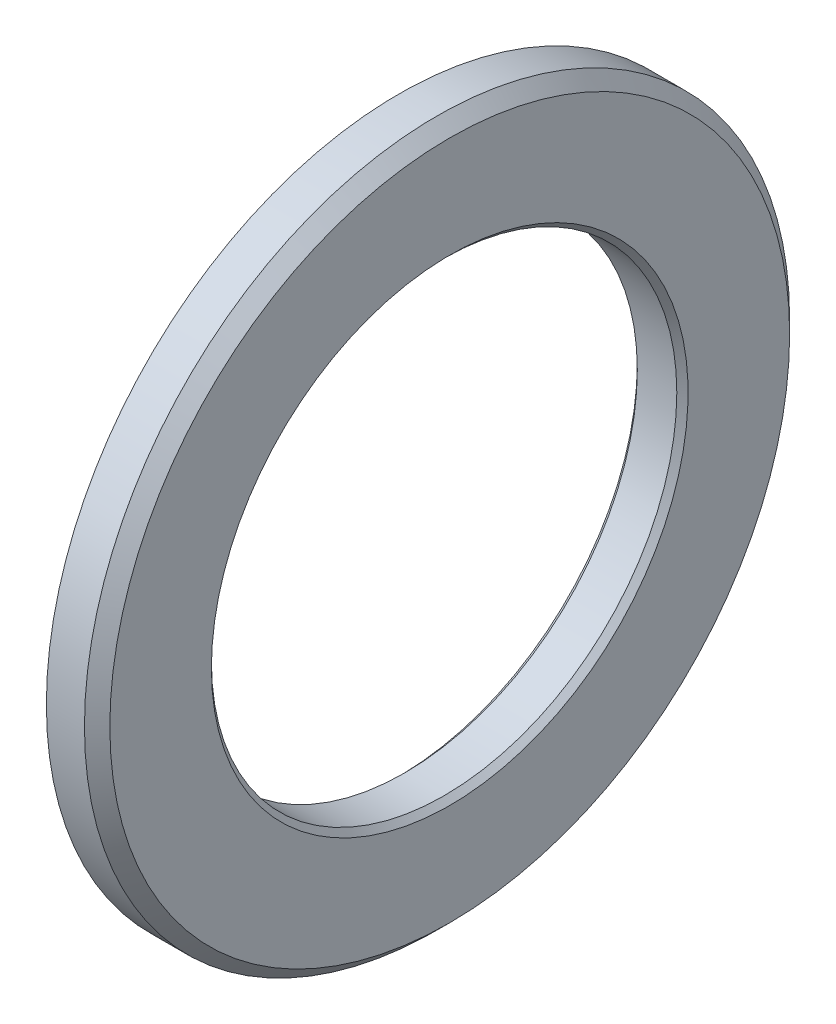
ISO-10303-21;
HEADER;
FILE_DESCRIPTION(('STEP AP214'),'2;1');
FILE_NAME('part.step','',(''),(''),'','','');
FILE_SCHEMA(('AUTOMOTIVE_DESIGN { 1 0 10303 214 1 1 1 1 }'));
ENDSEC;
DATA;
#1=APPLICATION_CONTEXT('core data for automotive mechanical design processes');
#2=APPLICATION_PROTOCOL_DEFINITION('international standard','automotive_design',2000,#1);
#3=PRODUCT_CONTEXT('',#1,'mechanical');
#4=PRODUCT('Part','Part','',(#3));
#5=PRODUCT_RELATED_PRODUCT_CATEGORY('part','',(#4));
#6=PRODUCT_DEFINITION_FORMATION('','',#4);
#7=PRODUCT_DEFINITION_CONTEXT('part definition',#1,'design');
#8=PRODUCT_DEFINITION('design','',#6,#7);
#9=PRODUCT_DEFINITION_SHAPE('','',#8);
#10=(LENGTH_UNIT() NAMED_UNIT(*) SI_UNIT(.MILLI.,.METRE.));
#11=(NAMED_UNIT(*) PLANE_ANGLE_UNIT() SI_UNIT($,.RADIAN.));
#12=(NAMED_UNIT(*) SI_UNIT($,.STERADIAN.) SOLID_ANGLE_UNIT());
#13=UNCERTAINTY_MEASURE_WITH_UNIT(LENGTH_MEASURE(1.E-05),#10,'distance_accuracy_value','');
#14=(GEOMETRIC_REPRESENTATION_CONTEXT(3) GLOBAL_UNCERTAINTY_ASSIGNED_CONTEXT((#13)) GLOBAL_UNIT_ASSIGNED_CONTEXT((#10,
#11,#12)) REPRESENTATION_CONTEXT('',''));
#15=CARTESIAN_POINT('',(0.,0.,0.));
#16=DIRECTION('',(0.,0.,1.));
#17=DIRECTION('',(1.,0.,0.));
#18=AXIS2_PLACEMENT_3D('',#15,#16,#17);
#19=CARTESIAN_POINT('',(-34.9249999999999,0.,0.));
#20=DIRECTION('',(-1.,0.,0.));
#21=DIRECTION('',(0.,0.,1.));
#22=AXIS2_PLACEMENT_3D('',#19,#20,#21);
#23=CYLINDRICAL_SURFACE('',#22,82.5);
#24=CARTESIAN_POINT('',(-16.,0.,0.));
#25=DIRECTION('',(1.,0.,0.));
#26=DIRECTION('',(0.,0.,-1.));
#27=AXIS2_PLACEMENT_3D('',#24,#25,#26);
#28=CIRCLE('',#27,82.5);
#29=CARTESIAN_POINT('',(-16.,0.,-82.5));
#30=VERTEX_POINT('',#29);
#31=EDGE_CURVE('E37',#30,#30,#28,.F.);
#32=ORIENTED_EDGE('',*,*,#31,.T.);
#33=EDGE_LOOP('',(#32));
#34=FACE_BOUND('',#33,.T.);
#35=CARTESIAN_POINT('',(-2.00000000000003,0.,0.));
#36=DIRECTION('',(-1.,0.,0.));
#37=DIRECTION('',(0.,0.,1.));
#38=AXIS2_PLACEMENT_3D('',#35,#36,#37);
#39=CIRCLE('',#38,82.5);
#40=CARTESIAN_POINT('',(-2.00000000000003,0.,82.5));
#41=VERTEX_POINT('',#40);
#42=EDGE_CURVE('E50',#41,#41,#39,.F.);
#43=ORIENTED_EDGE('',*,*,#42,.T.);
#44=EDGE_LOOP('',(#43));
#45=FACE_BOUND('',#44,.T.);
#46=ADVANCED_FACE('F30',(#34,#45),#23,.F.);
#47=CARTESIAN_POINT('',(0.,82.5,0.));
#48=DIRECTION('',(-1.,0.,0.));
#49=DIRECTION('',(0.,0.,1.));
#50=AXIS2_PLACEMENT_3D('',#47,#48,#49);
#51=PLANE('',#50);
#52=CARTESIAN_POINT('',(0.,0.,0.));
#53=DIRECTION('',(-1.,0.,0.));
#54=DIRECTION('',(0.,0.,1.));
#55=AXIS2_PLACEMENT_3D('',#52,#53,#54);
#56=CIRCLE('',#55,120.5);
#57=CARTESIAN_POINT('',(0.,0.,120.5));
#58=VERTEX_POINT('',#57);
#59=EDGE_CURVE('E41',#58,#58,#56,.F.);
#60=ORIENTED_EDGE('',*,*,#59,.T.);
#61=EDGE_LOOP('',(#60));
#62=FACE_BOUND('',#61,.T.);
#63=CARTESIAN_POINT('',(0.,0.,0.));
#64=DIRECTION('',(-1.,0.,0.));
#65=DIRECTION('',(0.,0.,1.));
#66=AXIS2_PLACEMENT_3D('',#63,#64,#65);
#67=CIRCLE('',#66,84.5);
#68=CARTESIAN_POINT('',(0.,0.,84.5));
#69=VERTEX_POINT('',#68);
#70=EDGE_CURVE('E53',#69,#69,#67,.T.);
#71=ORIENTED_EDGE('',*,*,#70,.T.);
#72=EDGE_LOOP('',(#71));
#73=FACE_BOUND('',#72,.T.);
#74=ADVANCED_FACE('F64',(#62,#73),#51,.F.);
#75=CARTESIAN_POINT('',(-34.9249999999999,0.,0.));
#76=DIRECTION('',(-1.,0.,0.));
#77=DIRECTION('',(0.,0.,1.));
#78=AXIS2_PLACEMENT_3D('',#75,#76,#77);
#79=CYLINDRICAL_SURFACE('',#78,125.);
#80=CARTESIAN_POINT('',(-4.49999999999999,0.,0.));
#81=DIRECTION('',(-1.,0.,0.));
#82=DIRECTION('',(0.,0.,1.));
#83=AXIS2_PLACEMENT_3D('',#80,#81,#82);
#84=CIRCLE('',#83,125.);
#85=CARTESIAN_POINT('',(-4.49999999999999,0.,125.));
#86=VERTEX_POINT('',#85);
#87=EDGE_CURVE('E45',#86,#86,#84,.T.);
#88=ORIENTED_EDGE('',*,*,#87,.T.);
#89=EDGE_LOOP('',(#88));
#90=FACE_BOUND('',#89,.T.);
#91=CARTESIAN_POINT('',(-18.,0.,0.));
#92=DIRECTION('',(-1.,0.,0.));
#93=DIRECTION('',(0.,0.,1.));
#94=AXIS2_PLACEMENT_3D('',#91,#92,#93);
#95=CIRCLE('',#94,125.);
#96=CARTESIAN_POINT('',(-18.,0.,125.));
#97=VERTEX_POINT('',#96);
#98=EDGE_CURVE('E56',#97,#97,#95,.T.);
#99=ORIENTED_EDGE('',*,*,#98,.F.);
#100=EDGE_LOOP('',(#99));
#101=FACE_BOUND('',#100,.T.);
#102=ADVANCED_FACE('F62',(#90,#101),#79,.T.);
#103=CARTESIAN_POINT('',(-18.,125.,0.));
#104=DIRECTION('',(1.,0.,0.));
#105=DIRECTION('',(0.,0.,-1.));
#106=AXIS2_PLACEMENT_3D('',#103,#104,#105);
#107=PLANE('',#106);
#108=CARTESIAN_POINT('',(-18.,0.,0.));
#109=DIRECTION('',(1.,0.,0.));
#110=DIRECTION('',(0.,0.,-1.));
#111=AXIS2_PLACEMENT_3D('',#108,#109,#110);
#112=CIRCLE('',#111,84.5);
#113=CARTESIAN_POINT('',(-18.,0.,-84.5));
#114=VERTEX_POINT('',#113);
#115=EDGE_CURVE('E10',#114,#114,#112,.T.);
#116=ORIENTED_EDGE('',*,*,#115,.T.);
#117=EDGE_LOOP('',(#116));
#118=FACE_BOUND('',#117,.T.);
#119=ORIENTED_EDGE('',*,*,#98,.T.);
#120=EDGE_LOOP('',(#119));
#121=FACE_BOUND('',#120,.T.);
#122=ADVANCED_FACE('F60',(#118,#121),#107,.F.);
#123=CARTESIAN_POINT('',(0.,0.,0.));
#124=DIRECTION('',(1.,0.,0.));
#125=DIRECTION('',(0.,0.,-1.));
#126=AXIS2_PLACEMENT_3D('',#123,#124,#125);
#127=CONICAL_SURFACE('',#126,84.5,0.785398163397438);
#128=ORIENTED_EDGE('',*,*,#42,.F.);
#129=EDGE_LOOP('',(#128));
#130=FACE_BOUND('',#129,.T.);
#131=ORIENTED_EDGE('',*,*,#70,.F.);
#132=EDGE_LOOP('',(#131));
#133=FACE_BOUND('',#132,.T.);
#134=ADVANCED_FACE('F71',(#130,#133),#127,.F.);
#135=CARTESIAN_POINT('',(-4.49999999999999,0.,0.));
#136=DIRECTION('',(-1.,0.,0.));
#137=DIRECTION('',(0.,0.,1.));
#138=AXIS2_PLACEMENT_3D('',#135,#136,#137);
#139=CONICAL_SURFACE('',#138,125.,0.78539816339745);
#140=ORIENTED_EDGE('',*,*,#59,.F.);
#141=EDGE_LOOP('',(#140));
#142=FACE_BOUND('',#141,.T.);
#143=ORIENTED_EDGE('',*,*,#87,.F.);
#144=EDGE_LOOP('',(#143));
#145=FACE_BOUND('',#144,.T.);
#146=ADVANCED_FACE('F82',(#142,#145),#139,.T.);
#147=CARTESIAN_POINT('',(-16.,0.,0.));
#148=DIRECTION('',(-1.,0.,0.));
#149=DIRECTION('',(0.,0.,1.));
#150=AXIS2_PLACEMENT_3D('',#147,#148,#149);
#151=CONICAL_SURFACE('',#150,82.5,0.78539816339745);
#152=ORIENTED_EDGE('',*,*,#115,.F.);
#153=EDGE_LOOP('',(#152));
#154=FACE_BOUND('',#153,.T.);
#155=ORIENTED_EDGE('',*,*,#31,.F.);
#156=EDGE_LOOP('',(#155));
#157=FACE_BOUND('',#156,.T.);
#158=ADVANCED_FACE('F32',(#154,#157),#151,.F.);
#159=CLOSED_SHELL('',(#46,#74,#102,#122,#134,#146,#158));
#160=MANIFOLD_SOLID_BREP('B2',#159);
#161=ADVANCED_BREP_SHAPE_REPRESENTATION('',(#18,#160),#14);
#162=SHAPE_DEFINITION_REPRESENTATION(#9,#161);
ENDSEC;
END-ISO-10303-21;
